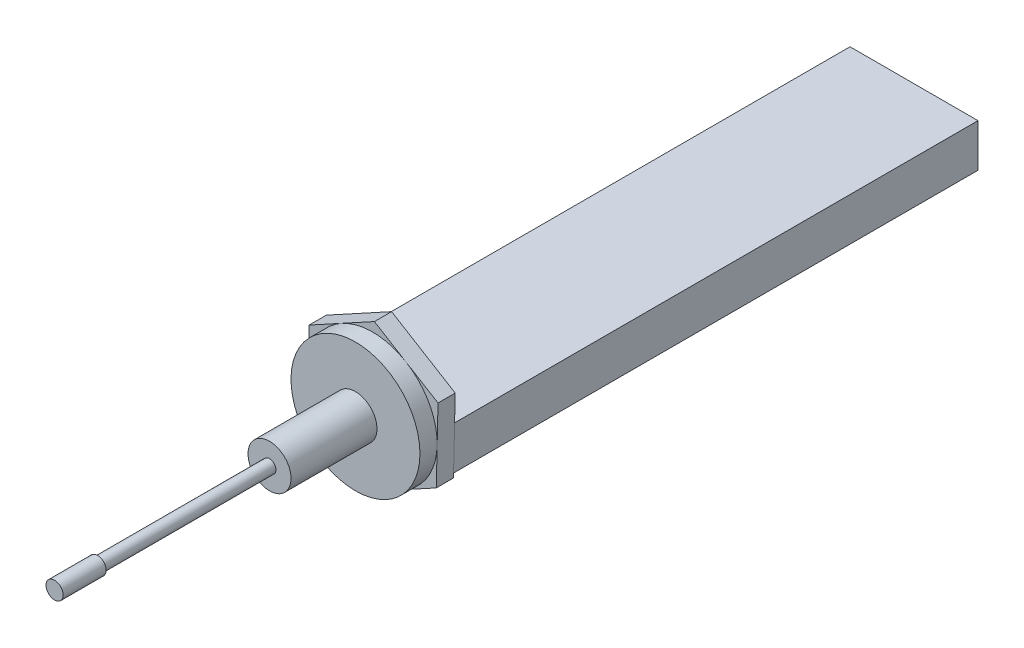
ISO-10303-21;
HEADER;
FILE_DESCRIPTION(('STEP AP214'),'2;1');
FILE_NAME('part.step','',(''),(''),'','','');
FILE_SCHEMA(('AUTOMOTIVE_DESIGN { 1 0 10303 214 1 1 1 1 }'));
ENDSEC;
DATA;
#1=APPLICATION_CONTEXT('core data for automotive mechanical design processes');
#2=APPLICATION_PROTOCOL_DEFINITION('international standard','automotive_design',2000,#1);
#3=PRODUCT_CONTEXT('',#1,'mechanical');
#4=PRODUCT('Part','Part','',(#3));
#5=PRODUCT_RELATED_PRODUCT_CATEGORY('part','',(#4));
#6=PRODUCT_DEFINITION_FORMATION('','',#4);
#7=PRODUCT_DEFINITION_CONTEXT('part definition',#1,'design');
#8=PRODUCT_DEFINITION('design','',#6,#7);
#9=PRODUCT_DEFINITION_SHAPE('','',#8);
#10=(LENGTH_UNIT() NAMED_UNIT(*) SI_UNIT(.MILLI.,.METRE.));
#11=(NAMED_UNIT(*) PLANE_ANGLE_UNIT() SI_UNIT($,.RADIAN.));
#12=(NAMED_UNIT(*) SI_UNIT($,.STERADIAN.) SOLID_ANGLE_UNIT());
#13=UNCERTAINTY_MEASURE_WITH_UNIT(LENGTH_MEASURE(1.E-05),#10,'distance_accuracy_value','');
#14=(GEOMETRIC_REPRESENTATION_CONTEXT(3) GLOBAL_UNCERTAINTY_ASSIGNED_CONTEXT((#13)) GLOBAL_UNIT_ASSIGNED_CONTEXT((#10,
#11,#12)) REPRESENTATION_CONTEXT('',''));
#15=CARTESIAN_POINT('',(0.,0.,0.));
#16=DIRECTION('',(0.,0.,1.));
#17=DIRECTION('',(1.,0.,0.));
#18=AXIS2_PLACEMENT_3D('',#15,#16,#17);
#19=CARTESIAN_POINT('',(0.,0.,-2.));
#20=DIRECTION('',(0.,0.,1.));
#21=DIRECTION('',(1.,0.,0.));
#22=AXIS2_PLACEMENT_3D('',#19,#20,#21);
#23=PLANE('',#22);
#24=DIRECTION('',(0.,-1.,0.));
#25=VECTOR('',#24,1.);
#26=CARTESIAN_POINT('',(7.40885718446834,-4.,-2.));
#27=LINE('',#26,#25);
#28=CARTESIAN_POINT('',(7.40885718446834,1.,-2.));
#29=VERTEX_POINT('',#28);
#30=CARTESIAN_POINT('',(7.40885718446834,-4.,-2.));
#31=VERTEX_POINT('',#30);
#32=EDGE_CURVE('E57',#29,#31,#27,.T.);
#33=ORIENTED_EDGE('',*,*,#32,.F.);
#34=DIRECTION('',(1.,0.,0.));
#35=VECTOR('',#34,1.);
#36=CARTESIAN_POINT('',(7.40885718446834,1.,-2.));
#37=LINE('',#36,#35);
#38=CARTESIAN_POINT('',(-7.47874022650646,0.999999999999174,-2.));
#39=VERTEX_POINT('',#38);
#40=EDGE_CURVE('E159',#39,#29,#37,.T.);
#41=ORIENTED_EDGE('',*,*,#40,.F.);
#42=DIRECTION('',(-0.0232880298504916,-0.999728797057323,0.));
#43=VECTOR('',#42,1.);
#44=CARTESIAN_POINT('',(-7.39712585065684,4.50361289961119,-2.));
#45=LINE('',#44,#43);
#46=CARTESIAN_POINT('',(-7.39712585065684,4.50361289961119,-2.));
#47=VERTEX_POINT('',#46);
#48=EDGE_CURVE('E218',#47,#39,#45,.T.);
#49=ORIENTED_EDGE('',*,*,#48,.F.);
#50=DIRECTION('',(-0.877434550071745,-0.479696373074046,0.));
#51=VECTOR('',#50,1.);
#52=CARTESIAN_POINT('',(0.201680254546159,8.657905351465,-2.));
#53=LINE('',#52,#51);
#54=CARTESIAN_POINT('',(0.201680254546159,8.657905351465,-2.));
#55=VERTEX_POINT('',#54);
#56=EDGE_CURVE('E213',#55,#47,#53,.T.);
#57=ORIENTED_EDGE('',*,*,#56,.F.);
#58=DIRECTION('',(-0.854146520221254,0.520032423983277,0.));
#59=VECTOR('',#58,1.);
#60=CARTESIAN_POINT('',(7.598806105203,4.15429245185381,-2.));
#61=LINE('',#60,#59);
#62=CARTESIAN_POINT('',(7.598806105203,4.15429245185381,-2.));
#63=VERTEX_POINT('',#62);
#64=EDGE_CURVE('E209',#63,#55,#61,.T.);
#65=ORIENTED_EDGE('',*,*,#64,.F.);
#66=DIRECTION('',(0.0232880298504911,0.999728797057323,0.));
#67=VECTOR('',#66,1.);
#68=CARTESIAN_POINT('',(7.39712585065685,-4.50361289961119,-2.));
#69=LINE('',#68,#67);
#70=EDGE_CURVE('E203',#31,#63,#69,.T.);
#71=ORIENTED_EDGE('',*,*,#70,.F.);
#72=EDGE_LOOP('',(#33,#41,#49,#57,#65,#71));
#73=FACE_BOUND('',#72,.T.);
#74=ADVANCED_FACE('F39',(#73),#23,.F.);
#75=DIRECTION('',(0.,1.,0.));
#76=VECTOR('',#75,1.);
#77=CARTESIAN_POINT('',(-7.47874022650645,-4.,-2.));
#78=LINE('',#77,#76);
#79=CARTESIAN_POINT('',(-7.47874022650645,-4.,-2.));
#80=VERTEX_POINT('',#79);
#81=EDGE_CURVE('E325',#80,#39,#78,.T.);
#82=ORIENTED_EDGE('',*,*,#81,.F.);
#83=DIRECTION('',(-1.,0.,0.));
#84=VECTOR('',#83,1.);
#85=CARTESIAN_POINT('',(7.40885718446834,-4.,-2.));
#86=LINE('',#85,#84);
#87=EDGE_CURVE('E65',#31,#80,#86,.T.);
#88=ORIENTED_EDGE('',*,*,#87,.F.);
#89=CARTESIAN_POINT('',(7.39712585065685,-4.50361289961119,-2.));
#90=VERTEX_POINT('',#89);
#91=EDGE_CURVE('E205',#90,#31,#69,.T.);
#92=ORIENTED_EDGE('',*,*,#91,.F.);
#93=DIRECTION('',(0.877434550071745,0.479696373074046,0.));
#94=VECTOR('',#93,1.);
#95=CARTESIAN_POINT('',(-0.201680254546153,-8.657905351465,-2.));
#96=LINE('',#95,#94);
#97=CARTESIAN_POINT('',(-0.201680254546153,-8.657905351465,-2.));
#98=VERTEX_POINT('',#97);
#99=EDGE_CURVE('E199',#98,#90,#96,.T.);
#100=ORIENTED_EDGE('',*,*,#99,.F.);
#101=DIRECTION('',(0.854146520221254,-0.520032423983278,0.));
#102=VECTOR('',#101,1.);
#103=CARTESIAN_POINT('',(-7.598806105203,-4.15429245185381,-2.));
#104=LINE('',#103,#102);
#105=CARTESIAN_POINT('',(-7.598806105203,-4.15429245185381,-2.));
#106=VERTEX_POINT('',#105);
#107=EDGE_CURVE('E222',#106,#98,#104,.T.);
#108=ORIENTED_EDGE('',*,*,#107,.F.);
#109=EDGE_CURVE('E217',#39,#106,#45,.T.);
#110=ORIENTED_EDGE('',*,*,#109,.F.);
#111=EDGE_LOOP('',(#82,#88,#92,#100,#108,#110));
#112=FACE_BOUND('',#111,.T.);
#113=ADVANCED_FACE('F355',(#112),#23,.F.);
#114=CARTESIAN_POINT('',(0.,0.,0.));
#115=DIRECTION('',(0.,0.,1.));
#116=DIRECTION('',(1.,0.,0.));
#117=AXIS2_PLACEMENT_3D('',#114,#115,#116);
#118=PLANE('',#117);
#119=CARTESIAN_POINT('',(0.,0.,0.));
#120=DIRECTION('',(0.,0.,1.));
#121=DIRECTION('',(1.,0.,0.));
#122=AXIS2_PLACEMENT_3D('',#119,#120,#121);
#123=CIRCLE('',#122,7.5);
#124=CARTESIAN_POINT('',(3.90024317987458,6.4060989016594,0.));
#125=VERTEX_POINT('',#124);
#126=CARTESIAN_POINT('',(-3.59772279805534,6.58075912553809,0.));
#127=VERTEX_POINT('',#126);
#128=EDGE_CURVE('E185',#125,#127,#123,.T.);
#129=ORIENTED_EDGE('',*,*,#128,.F.);
#130=DIRECTION('',(-0.854146520221254,0.520032423983277,0.));
#131=VECTOR('',#130,1.);
#132=CARTESIAN_POINT('',(7.598806105203,4.15429245185381,0.));
#133=LINE('',#132,#131);
#134=CARTESIAN_POINT('',(0.201680254546159,8.657905351465,0.));
#135=VERTEX_POINT('',#134);
#136=EDGE_CURVE('E235',#125,#135,#133,.T.);
#137=ORIENTED_EDGE('',*,*,#136,.T.);
#138=DIRECTION('',(-0.877434550071745,-0.479696373074046,0.));
#139=VECTOR('',#138,1.);
#140=CARTESIAN_POINT('',(0.201680254546159,8.657905351465,0.));
#141=LINE('',#140,#139);
#142=EDGE_CURVE('E240',#135,#127,#141,.T.);
#143=ORIENTED_EDGE('',*,*,#142,.T.);
#144=EDGE_LOOP('',(#129,#137,#143));
#145=FACE_BOUND('',#144,.T.);
#146=ADVANCED_FACE('F310',(#145),#118,.T.);
#147=CARTESIAN_POINT('',(-7.49796597792992,0.174660223878687,0.));
#148=VERTEX_POINT('',#147);
#149=EDGE_CURVE('E189',#127,#148,#123,.T.);
#150=ORIENTED_EDGE('',*,*,#149,.F.);
#151=CARTESIAN_POINT('',(-7.39712585065684,4.50361289961119,0.));
#152=VERTEX_POINT('',#151);
#153=EDGE_CURVE('E239',#127,#152,#141,.T.);
#154=ORIENTED_EDGE('',*,*,#153,.T.);
#155=DIRECTION('',(-0.0232880298504916,-0.999728797057323,0.));
#156=VECTOR('',#155,1.);
#157=CARTESIAN_POINT('',(-7.39712585065684,4.50361289961119,0.));
#158=LINE('',#157,#156);
#159=EDGE_CURVE('E245',#152,#148,#158,.T.);
#160=ORIENTED_EDGE('',*,*,#159,.T.);
#161=EDGE_LOOP('',(#150,#154,#160));
#162=FACE_BOUND('',#161,.T.);
#163=ADVANCED_FACE('F303',(#162),#118,.T.);
#164=CARTESIAN_POINT('',(-3.90024317987458,-6.4060989016594,0.));
#165=VERTEX_POINT('',#164);
#166=EDGE_CURVE('E296',#148,#165,#123,.T.);
#167=ORIENTED_EDGE('',*,*,#166,.F.);
#168=CARTESIAN_POINT('',(-7.598806105203,-4.15429245185381,0.));
#169=VERTEX_POINT('',#168);
#170=EDGE_CURVE('E244',#148,#169,#158,.T.);
#171=ORIENTED_EDGE('',*,*,#170,.T.);
#172=DIRECTION('',(0.854146520221254,-0.520032423983278,0.));
#173=VECTOR('',#172,1.);
#174=CARTESIAN_POINT('',(-7.598806105203,-4.15429245185381,0.));
#175=LINE('',#174,#173);
#176=EDGE_CURVE('E204',#169,#165,#175,.T.);
#177=ORIENTED_EDGE('',*,*,#176,.T.);
#178=EDGE_LOOP('',(#167,#171,#177));
#179=FACE_BOUND('',#178,.T.);
#180=ADVANCED_FACE('F518',(#179),#118,.T.);
#181=CARTESIAN_POINT('',(3.59772279805534,-6.58075912553809,0.));
#182=VERTEX_POINT('',#181);
#183=EDGE_CURVE('E292',#165,#182,#123,.T.);
#184=ORIENTED_EDGE('',*,*,#183,.F.);
#185=CARTESIAN_POINT('',(-0.201680254546153,-8.657905351465,0.));
#186=VERTEX_POINT('',#185);
#187=EDGE_CURVE('E249',#165,#186,#175,.T.);
#188=ORIENTED_EDGE('',*,*,#187,.T.);
#189=DIRECTION('',(0.877434550071745,0.479696373074046,0.));
#190=VECTOR('',#189,1.);
#191=CARTESIAN_POINT('',(-0.201680254546153,-8.657905351465,0.));
#192=LINE('',#191,#190);
#193=EDGE_CURVE('E226',#186,#182,#192,.T.);
#194=ORIENTED_EDGE('',*,*,#193,.T.);
#195=EDGE_LOOP('',(#184,#188,#194));
#196=FACE_BOUND('',#195,.T.);
#197=ADVANCED_FACE('F525',(#196),#118,.T.);
#198=CARTESIAN_POINT('',(7.49796597792992,-0.174660223878683,0.));
#199=VERTEX_POINT('',#198);
#200=EDGE_CURVE('E286',#182,#199,#123,.T.);
#201=ORIENTED_EDGE('',*,*,#200,.F.);
#202=CARTESIAN_POINT('',(7.39712585065685,-4.50361289961119,0.));
#203=VERTEX_POINT('',#202);
#204=EDGE_CURVE('E194',#182,#203,#192,.T.);
#205=ORIENTED_EDGE('',*,*,#204,.T.);
#206=DIRECTION('',(0.0232880298504911,0.999728797057323,0.));
#207=VECTOR('',#206,1.);
#208=CARTESIAN_POINT('',(7.39712585065685,-4.50361289961119,0.));
#209=LINE('',#208,#207);
#210=EDGE_CURVE('E231',#203,#199,#209,.T.);
#211=ORIENTED_EDGE('',*,*,#210,.T.);
#212=EDGE_LOOP('',(#201,#205,#211));
#213=FACE_BOUND('',#212,.T.);
#214=ADVANCED_FACE('F285',(#213),#118,.T.);
#215=CARTESIAN_POINT('',(-0.201680254546153,-8.657905351465,-2.));
#216=DIRECTION('',(0.479696373074046,-0.877434550071745,0.));
#217=DIRECTION('',(0.877434550071745,0.479696373074046,0.));
#218=AXIS2_PLACEMENT_3D('',#215,#216,#217);
#219=PLANE('',#218);
#220=ORIENTED_EDGE('',*,*,#193,.F.);
#221=DIRECTION('',(0.,0.,1.));
#222=VECTOR('',#221,1.);
#223=CARTESIAN_POINT('',(-0.201680254546153,-8.657905351465,-2.));
#224=LINE('',#223,#222);
#225=EDGE_CURVE('E253',#98,#186,#224,.T.);
#226=ORIENTED_EDGE('',*,*,#225,.F.);
#227=ORIENTED_EDGE('',*,*,#99,.T.);
#228=DIRECTION('',(0.,0.,1.));
#229=VECTOR('',#228,1.);
#230=CARTESIAN_POINT('',(7.39712585065685,-4.50361289961119,-2.));
#231=LINE('',#230,#229);
#232=EDGE_CURVE('E43',#90,#203,#231,.T.);
#233=ORIENTED_EDGE('',*,*,#232,.T.);
#234=ORIENTED_EDGE('',*,*,#204,.F.);
#235=EDGE_LOOP('',(#220,#226,#227,#233,#234));
#236=FACE_BOUND('',#235,.T.);
#237=ADVANCED_FACE('F41',(#236),#219,.T.);
#238=CARTESIAN_POINT('',(-7.598806105203,-4.15429245185381,-2.));
#239=DIRECTION('',(-0.520032423983278,-0.854146520221254,0.));
#240=DIRECTION('',(0.854146520221254,-0.520032423983278,0.));
#241=AXIS2_PLACEMENT_3D('',#238,#239,#240);
#242=PLANE('',#241);
#243=ORIENTED_EDGE('',*,*,#176,.F.);
#244=DIRECTION('',(0.,0.,1.));
#245=VECTOR('',#244,1.);
#246=CARTESIAN_POINT('',(-7.598806105203,-4.15429245185381,-2.));
#247=LINE('',#246,#245);
#248=EDGE_CURVE('E257',#106,#169,#247,.T.);
#249=ORIENTED_EDGE('',*,*,#248,.F.);
#250=ORIENTED_EDGE('',*,*,#107,.T.);
#251=ORIENTED_EDGE('',*,*,#225,.T.);
#252=ORIENTED_EDGE('',*,*,#187,.F.);
#253=EDGE_LOOP('',(#243,#249,#250,#251,#252));
#254=FACE_BOUND('',#253,.T.);
#255=ADVANCED_FACE('F367',(#254),#242,.T.);
#256=CARTESIAN_POINT('',(-7.39712585065684,4.50361289961119,-2.));
#257=DIRECTION('',(-0.999728797057323,0.0232880298504916,0.));
#258=DIRECTION('',(-0.0232880298504916,-0.999728797057323,0.));
#259=AXIS2_PLACEMENT_3D('',#256,#257,#258);
#260=PLANE('',#259);
#261=ORIENTED_EDGE('',*,*,#159,.F.);
#262=DIRECTION('',(0.,0.,1.));
#263=VECTOR('',#262,1.);
#264=CARTESIAN_POINT('',(-7.39712585065684,4.50361289961119,-2.));
#265=LINE('',#264,#263);
#266=EDGE_CURVE('E261',#47,#152,#265,.T.);
#267=ORIENTED_EDGE('',*,*,#266,.F.);
#268=ORIENTED_EDGE('',*,*,#48,.T.);
#269=ORIENTED_EDGE('',*,*,#109,.T.);
#270=ORIENTED_EDGE('',*,*,#248,.T.);
#271=ORIENTED_EDGE('',*,*,#170,.F.);
#272=EDGE_LOOP('',(#261,#267,#268,#269,#270,#271));
#273=FACE_BOUND('',#272,.T.);
#274=ADVANCED_FACE('F321',(#273),#260,.T.);
#275=CARTESIAN_POINT('',(0.201680254546159,8.657905351465,-2.));
#276=DIRECTION('',(-0.479696373074046,0.877434550071745,0.));
#277=DIRECTION('',(-0.877434550071745,-0.479696373074046,0.));
#278=AXIS2_PLACEMENT_3D('',#275,#276,#277);
#279=PLANE('',#278);
#280=ORIENTED_EDGE('',*,*,#142,.F.);
#281=DIRECTION('',(0.,0.,1.));
#282=VECTOR('',#281,1.);
#283=CARTESIAN_POINT('',(0.201680254546159,8.657905351465,-2.));
#284=LINE('',#283,#282);
#285=EDGE_CURVE('E265',#55,#135,#284,.T.);
#286=ORIENTED_EDGE('',*,*,#285,.F.);
#287=ORIENTED_EDGE('',*,*,#56,.T.);
#288=ORIENTED_EDGE('',*,*,#266,.T.);
#289=ORIENTED_EDGE('',*,*,#153,.F.);
#290=EDGE_LOOP('',(#280,#286,#287,#288,#289));
#291=FACE_BOUND('',#290,.T.);
#292=ADVANCED_FACE('F307',(#291),#279,.T.);
#293=CARTESIAN_POINT('',(7.598806105203,4.15429245185381,-2.));
#294=DIRECTION('',(0.520032423983277,0.854146520221254,0.));
#295=DIRECTION('',(-0.854146520221254,0.520032423983277,0.));
#296=AXIS2_PLACEMENT_3D('',#293,#294,#295);
#297=PLANE('',#296);
#298=CARTESIAN_POINT('',(7.598806105203,4.15429245185381,0.));
#299=VERTEX_POINT('',#298);
#300=EDGE_CURVE('E236',#299,#125,#133,.T.);
#301=ORIENTED_EDGE('',*,*,#300,.F.);
#302=DIRECTION('',(0.,0.,1.));
#303=VECTOR('',#302,1.);
#304=CARTESIAN_POINT('',(7.598806105203,4.15429245185381,-2.));
#305=LINE('',#304,#303);
#306=EDGE_CURVE('E268',#63,#299,#305,.T.);
#307=ORIENTED_EDGE('',*,*,#306,.F.);
#308=ORIENTED_EDGE('',*,*,#64,.T.);
#309=ORIENTED_EDGE('',*,*,#285,.T.);
#310=ORIENTED_EDGE('',*,*,#136,.F.);
#311=EDGE_LOOP('',(#301,#307,#308,#309,#310));
#312=FACE_BOUND('',#311,.T.);
#313=ADVANCED_FACE('F314',(#312),#297,.T.);
#314=CARTESIAN_POINT('',(7.39712585065685,-4.50361289961119,-2.));
#315=DIRECTION('',(0.999728797057323,-0.0232880298504911,0.));
#316=DIRECTION('',(0.0232880298504911,0.999728797057323,0.));
#317=AXIS2_PLACEMENT_3D('',#314,#315,#316);
#318=PLANE('',#317);
#319=ORIENTED_EDGE('',*,*,#210,.F.);
#320=ORIENTED_EDGE('',*,*,#232,.F.);
#321=ORIENTED_EDGE('',*,*,#91,.T.);
#322=ORIENTED_EDGE('',*,*,#70,.T.);
#323=ORIENTED_EDGE('',*,*,#306,.T.);
#324=EDGE_CURVE('E230',#199,#299,#209,.T.);
#325=ORIENTED_EDGE('',*,*,#324,.F.);
#326=EDGE_LOOP('',(#319,#320,#321,#322,#323,#325));
#327=FACE_BOUND('',#326,.T.);
#328=ADVANCED_FACE('F282',(#327),#318,.T.);
#329=EDGE_CURVE('E198',#199,#125,#123,.T.);
#330=ORIENTED_EDGE('',*,*,#329,.F.);
#331=ORIENTED_EDGE('',*,*,#324,.T.);
#332=ORIENTED_EDGE('',*,*,#300,.T.);
#333=EDGE_LOOP('',(#330,#331,#332));
#334=FACE_BOUND('',#333,.T.);
#335=ADVANCED_FACE('F363',(#334),#118,.T.);
#336=CARTESIAN_POINT('',(0.,0.,2.));
#337=DIRECTION('',(0.,0.,-1.));
#338=DIRECTION('',(-1.,0.,0.));
#339=AXIS2_PLACEMENT_3D('',#336,#337,#338);
#340=CYLINDRICAL_SURFACE('',#339,7.5);
#341=CARTESIAN_POINT('',(0.,0.,2.));
#342=DIRECTION('',(0.,0.,1.));
#343=DIRECTION('',(1.,0.,0.));
#344=AXIS2_PLACEMENT_3D('',#341,#342,#343);
#345=CIRCLE('',#344,7.5);
#346=CARTESIAN_POINT('',(7.5,0.,2.));
#347=VERTEX_POINT('',#346);
#348=EDGE_CURVE('E190',#347,#347,#345,.T.);
#349=ORIENTED_EDGE('',*,*,#348,.F.);
#350=EDGE_LOOP('',(#349));
#351=FACE_BOUND('',#350,.T.);
#352=ORIENTED_EDGE('',*,*,#128,.T.);
#353=ORIENTED_EDGE('',*,*,#149,.T.);
#354=ORIENTED_EDGE('',*,*,#166,.T.);
#355=ORIENTED_EDGE('',*,*,#183,.T.);
#356=ORIENTED_EDGE('',*,*,#200,.T.);
#357=ORIENTED_EDGE('',*,*,#329,.T.);
#358=EDGE_LOOP('',(#352,#353,#354,#355,#356,#357));
#359=FACE_BOUND('',#358,.T.);
#360=ADVANCED_FACE('F290',(#351,#359),#340,.T.);
#361=CARTESIAN_POINT('',(0.,0.,2.));
#362=DIRECTION('',(0.,0.,1.));
#363=DIRECTION('',(1.,0.,0.));
#364=AXIS2_PLACEMENT_3D('',#361,#362,#363);
#365=PLANE('',#364);
#366=CARTESIAN_POINT('',(0.,0.,2.));
#367=DIRECTION('',(0.,0.,1.));
#368=DIRECTION('',(1.,0.,0.));
#369=AXIS2_PLACEMENT_3D('',#366,#367,#368);
#370=CIRCLE('',#369,2.5);
#371=CARTESIAN_POINT('',(2.5,0.,2.));
#372=VERTEX_POINT('',#371);
#373=EDGE_CURVE('E49',#372,#372,#370,.T.);
#374=ORIENTED_EDGE('',*,*,#373,.F.);
#375=EDGE_LOOP('',(#374));
#376=FACE_BOUND('',#375,.T.);
#377=ORIENTED_EDGE('',*,*,#348,.T.);
#378=EDGE_LOOP('',(#377));
#379=FACE_BOUND('',#378,.T.);
#380=ADVANCED_FACE('F393',(#376,#379),#365,.T.);
#381=CARTESIAN_POINT('',(0.,0.,12.));
#382=DIRECTION('',(0.,0.,-1.));
#383=DIRECTION('',(-1.,0.,0.));
#384=AXIS2_PLACEMENT_3D('',#381,#382,#383);
#385=CYLINDRICAL_SURFACE('',#384,2.5);
#386=CARTESIAN_POINT('',(0.,0.,12.));
#387=DIRECTION('',(0.,0.,1.));
#388=DIRECTION('',(1.,0.,0.));
#389=AXIS2_PLACEMENT_3D('',#386,#387,#388);
#390=CIRCLE('',#389,2.5);
#391=CARTESIAN_POINT('',(2.5,0.,12.));
#392=VERTEX_POINT('',#391);
#393=EDGE_CURVE('E180',#392,#392,#390,.T.);
#394=ORIENTED_EDGE('',*,*,#393,.F.);
#395=EDGE_LOOP('',(#394));
#396=FACE_BOUND('',#395,.T.);
#397=ORIENTED_EDGE('',*,*,#373,.T.);
#398=EDGE_LOOP('',(#397));
#399=FACE_BOUND('',#398,.T.);
#400=ADVANCED_FACE('F400',(#396,#399),#385,.T.);
#401=CARTESIAN_POINT('',(0.,0.,12.));
#402=DIRECTION('',(0.,0.,1.));
#403=DIRECTION('',(1.,0.,0.));
#404=AXIS2_PLACEMENT_3D('',#401,#402,#403);
#405=PLANE('',#404);
#406=CARTESIAN_POINT('',(0.,0.,12.));
#407=DIRECTION('',(0.,0.,1.));
#408=DIRECTION('',(1.,0.,0.));
#409=AXIS2_PLACEMENT_3D('',#406,#407,#408);
#410=CIRCLE('',#409,0.75);
#411=CARTESIAN_POINT('',(0.75,0.,12.));
#412=VERTEX_POINT('',#411);
#413=EDGE_CURVE('E11',#412,#412,#410,.T.);
#414=ORIENTED_EDGE('',*,*,#413,.F.);
#415=EDGE_LOOP('',(#414));
#416=FACE_BOUND('',#415,.T.);
#417=ORIENTED_EDGE('',*,*,#393,.T.);
#418=EDGE_LOOP('',(#417));
#419=FACE_BOUND('',#418,.T.);
#420=ADVANCED_FACE('F407',(#416,#419),#405,.T.);
#421=CARTESIAN_POINT('',(0.,0.,32.));
#422=DIRECTION('',(0.,0.,-1.));
#423=DIRECTION('',(-1.,0.,0.));
#424=AXIS2_PLACEMENT_3D('',#421,#422,#423);
#425=CYLINDRICAL_SURFACE('',#424,0.75);
#426=CARTESIAN_POINT('',(0.,0.,32.));
#427=DIRECTION('',(0.,0.,1.));
#428=DIRECTION('',(1.,0.,0.));
#429=AXIS2_PLACEMENT_3D('',#426,#427,#428);
#430=CIRCLE('',#429,0.75);
#431=CARTESIAN_POINT('',(0.75,0.,32.));
#432=VERTEX_POINT('',#431);
#433=EDGE_CURVE('E176',#432,#432,#430,.T.);
#434=ORIENTED_EDGE('',*,*,#433,.F.);
#435=EDGE_LOOP('',(#434));
#436=FACE_BOUND('',#435,.T.);
#437=ORIENTED_EDGE('',*,*,#413,.T.);
#438=EDGE_LOOP('',(#437));
#439=FACE_BOUND('',#438,.T.);
#440=ADVANCED_FACE('F415',(#436,#439),#425,.T.);
#441=CARTESIAN_POINT('',(0.,0.,37.));
#442=DIRECTION('',(0.,0.,-1.));
#443=DIRECTION('',(-1.,0.,0.));
#444=AXIS2_PLACEMENT_3D('',#441,#442,#443);
#445=CYLINDRICAL_SURFACE('',#444,1.);
#446=CARTESIAN_POINT('',(0.,0.,37.));
#447=DIRECTION('',(0.,0.,1.));
#448=DIRECTION('',(1.,0.,0.));
#449=AXIS2_PLACEMENT_3D('',#446,#447,#448);
#450=CIRCLE('',#449,1.);
#451=CARTESIAN_POINT('',(1.,0.,37.));
#452=VERTEX_POINT('',#451);
#453=EDGE_CURVE('E168',#452,#452,#450,.T.);
#454=ORIENTED_EDGE('',*,*,#453,.F.);
#455=EDGE_LOOP('',(#454));
#456=FACE_BOUND('',#455,.T.);
#457=CARTESIAN_POINT('',(0.,0.,32.));
#458=DIRECTION('',(0.,0.,1.));
#459=DIRECTION('',(1.,0.,0.));
#460=AXIS2_PLACEMENT_3D('',#457,#458,#459);
#461=CIRCLE('',#460,1.);
#462=CARTESIAN_POINT('',(1.,0.,32.));
#463=VERTEX_POINT('',#462);
#464=EDGE_CURVE('E163',#463,#463,#461,.T.);
#465=ORIENTED_EDGE('',*,*,#464,.T.);
#466=EDGE_LOOP('',(#465));
#467=FACE_BOUND('',#466,.T.);
#468=ADVANCED_FACE('F423',(#456,#467),#445,.T.);
#469=CARTESIAN_POINT('',(0.,0.,37.));
#470=DIRECTION('',(0.,0.,1.));
#471=DIRECTION('',(1.,0.,0.));
#472=AXIS2_PLACEMENT_3D('',#469,#470,#471);
#473=PLANE('',#472);
#474=ORIENTED_EDGE('',*,*,#453,.T.);
#475=EDGE_LOOP('',(#474));
#476=FACE_BOUND('',#475,.T.);
#477=ADVANCED_FACE('F431',(#476),#473,.T.);
#478=CARTESIAN_POINT('',(0.,0.,32.));
#479=DIRECTION('',(0.,0.,1.));
#480=DIRECTION('',(1.,0.,0.));
#481=AXIS2_PLACEMENT_3D('',#478,#479,#480);
#482=PLANE('',#481);
#483=ORIENTED_EDGE('',*,*,#433,.T.);
#484=EDGE_LOOP('',(#483));
#485=FACE_BOUND('',#484,.T.);
#486=ORIENTED_EDGE('',*,*,#464,.F.);
#487=EDGE_LOOP('',(#486));
#488=FACE_BOUND('',#487,.T.);
#489=ADVANCED_FACE('F439',(#485,#488),#482,.F.);
#490=CARTESIAN_POINT('',(7.40885718446834,-4.,-63.));
#491=DIRECTION('',(-1.,0.,0.));
#492=DIRECTION('',(0.,0.,1.));
#493=AXIS2_PLACEMENT_3D('',#490,#491,#492);
#494=PLANE('',#493);
#495=ORIENTED_EDGE('',*,*,#32,.T.);
#496=DIRECTION('',(0.,0.,1.));
#497=VECTOR('',#496,1.);
#498=CARTESIAN_POINT('',(7.40885718446834,-4.,-63.));
#499=LINE('',#498,#497);
#500=CARTESIAN_POINT('',(7.40885718446834,-4.,-63.));
#501=VERTEX_POINT('',#500);
#502=EDGE_CURVE('E142',#501,#31,#499,.T.);
#503=ORIENTED_EDGE('',*,*,#502,.F.);
#504=DIRECTION('',(0.,-1.,0.));
#505=VECTOR('',#504,1.);
#506=CARTESIAN_POINT('',(7.40885718446834,-4.,-63.));
#507=LINE('',#506,#505);
#508=CARTESIAN_POINT('',(7.40885718446834,1.,-63.));
#509=VERTEX_POINT('',#508);
#510=EDGE_CURVE('E149',#509,#501,#507,.T.);
#511=ORIENTED_EDGE('',*,*,#510,.F.);
#512=DIRECTION('',(0.,0.,1.));
#513=VECTOR('',#512,1.);
#514=CARTESIAN_POINT('',(7.40885718446834,1.,-63.));
#515=LINE('',#514,#513);
#516=EDGE_CURVE('E333',#509,#29,#515,.T.);
#517=ORIENTED_EDGE('',*,*,#516,.T.);
#518=EDGE_LOOP('',(#495,#503,#511,#517));
#519=FACE_BOUND('',#518,.T.);
#520=ADVANCED_FACE('F161',(#519),#494,.F.);
#521=CARTESIAN_POINT('',(7.40885718446834,-4.,-63.));
#522=DIRECTION('',(0.,1.,0.));
#523=DIRECTION('',(0.,0.,1.));
#524=AXIS2_PLACEMENT_3D('',#521,#522,#523);
#525=PLANE('',#524);
#526=ORIENTED_EDGE('',*,*,#87,.T.);
#527=DIRECTION('',(0.,0.,1.));
#528=VECTOR('',#527,1.);
#529=CARTESIAN_POINT('',(-7.47874022650645,-4.,-63.));
#530=LINE('',#529,#528);
#531=CARTESIAN_POINT('',(-7.47874022650645,-4.,-63.));
#532=VERTEX_POINT('',#531);
#533=EDGE_CURVE('E144',#532,#80,#530,.T.);
#534=ORIENTED_EDGE('',*,*,#533,.F.);
#535=DIRECTION('',(-1.,0.,0.));
#536=VECTOR('',#535,1.);
#537=CARTESIAN_POINT('',(7.40885718446834,-4.,-63.));
#538=LINE('',#537,#536);
#539=EDGE_CURVE('E138',#501,#532,#538,.T.);
#540=ORIENTED_EDGE('',*,*,#539,.F.);
#541=ORIENTED_EDGE('',*,*,#502,.T.);
#542=EDGE_LOOP('',(#526,#534,#540,#541));
#543=FACE_BOUND('',#542,.T.);
#544=ADVANCED_FACE('F140',(#543),#525,.F.);
#545=CARTESIAN_POINT('',(-7.47874022650645,-4.,-63.));
#546=DIRECTION('',(1.,0.,0.));
#547=DIRECTION('',(0.,0.,-1.));
#548=AXIS2_PLACEMENT_3D('',#545,#546,#547);
#549=PLANE('',#548);
#550=ORIENTED_EDGE('',*,*,#81,.T.);
#551=DIRECTION('',(0.,0.,1.));
#552=VECTOR('',#551,1.);
#553=CARTESIAN_POINT('',(-7.47874022650645,1.,-63.));
#554=LINE('',#553,#552);
#555=CARTESIAN_POINT('',(-7.47874022650645,1.,-63.));
#556=VERTEX_POINT('',#555);
#557=EDGE_CURVE('E170',#556,#39,#554,.T.);
#558=ORIENTED_EDGE('',*,*,#557,.F.);
#559=DIRECTION('',(0.,1.,0.));
#560=VECTOR('',#559,1.);
#561=CARTESIAN_POINT('',(-7.47874022650645,-4.,-63.));
#562=LINE('',#561,#560);
#563=EDGE_CURVE('E148',#532,#556,#562,.T.);
#564=ORIENTED_EDGE('',*,*,#563,.F.);
#565=ORIENTED_EDGE('',*,*,#533,.T.);
#566=EDGE_LOOP('',(#550,#558,#564,#565));
#567=FACE_BOUND('',#566,.T.);
#568=ADVANCED_FACE('F327',(#567),#549,.F.);
#569=CARTESIAN_POINT('',(7.40885718446834,1.,-63.));
#570=DIRECTION('',(0.,-1.,0.));
#571=DIRECTION('',(0.,0.,-1.));
#572=AXIS2_PLACEMENT_3D('',#569,#570,#571);
#573=PLANE('',#572);
#574=ORIENTED_EDGE('',*,*,#40,.T.);
#575=ORIENTED_EDGE('',*,*,#516,.F.);
#576=DIRECTION('',(1.,0.,0.));
#577=VECTOR('',#576,1.);
#578=CARTESIAN_POINT('',(7.40885718446834,1.,-63.));
#579=LINE('',#578,#577);
#580=EDGE_CURVE('E154',#556,#509,#579,.T.);
#581=ORIENTED_EDGE('',*,*,#580,.F.);
#582=ORIENTED_EDGE('',*,*,#557,.T.);
#583=EDGE_LOOP('',(#574,#575,#581,#582));
#584=FACE_BOUND('',#583,.T.);
#585=ADVANCED_FACE('F331',(#584),#573,.F.);
#586=CARTESIAN_POINT('',(0.,0.,-63.));
#587=DIRECTION('',(0.,0.,1.));
#588=DIRECTION('',(1.,0.,0.));
#589=AXIS2_PLACEMENT_3D('',#586,#587,#588);
#590=PLANE('',#589);
#591=ORIENTED_EDGE('',*,*,#510,.T.);
#592=ORIENTED_EDGE('',*,*,#539,.T.);
#593=ORIENTED_EDGE('',*,*,#563,.T.);
#594=ORIENTED_EDGE('',*,*,#580,.T.);
#595=EDGE_LOOP('',(#591,#592,#593,#594));
#596=FACE_BOUND('',#595,.T.);
#597=ADVANCED_FACE('F152',(#596),#590,.F.);
#598=CLOSED_SHELL('',(#74,#113,#146,#163,#180,#197,#214,#237,#255,#274,#292,#313,#328,#335,#360,
#380,#400,#420,#440,#468,#477,#489,#520,#544,#568,#585,#597));
#599=MANIFOLD_SOLID_BREP('B2',#598);
#600=ADVANCED_BREP_SHAPE_REPRESENTATION('',(#18,#599),#14);
#601=SHAPE_DEFINITION_REPRESENTATION(#9,#600);
ENDSEC;
END-ISO-10303-21;
